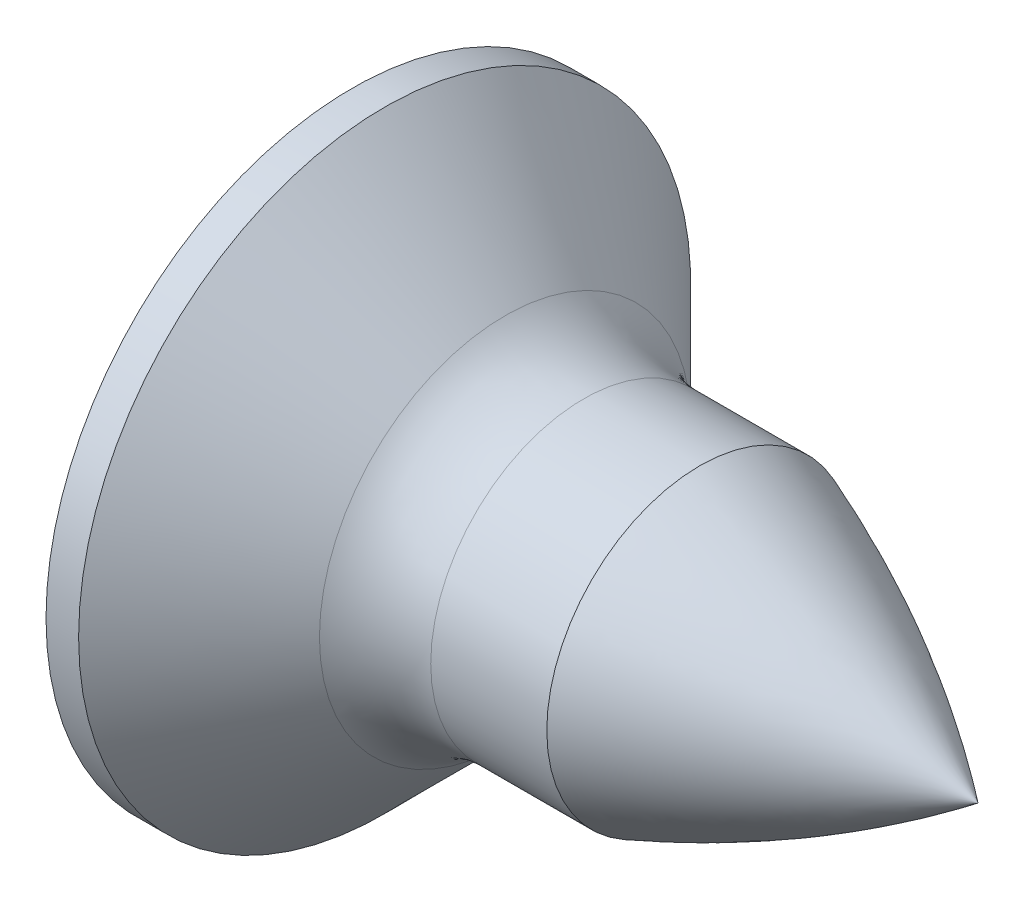
ISO-10303-21;
HEADER;
FILE_DESCRIPTION(('STEP AP214'),'2;1');
FILE_NAME('part.step','',(''),(''),'','','');
FILE_SCHEMA(('AUTOMOTIVE_DESIGN { 1 0 10303 214 1 1 1 1 }'));
ENDSEC;
DATA;
#1=APPLICATION_CONTEXT('core data for automotive mechanical design processes');
#2=APPLICATION_PROTOCOL_DEFINITION('international standard','automotive_design',2000,#1);
#3=PRODUCT_CONTEXT('',#1,'mechanical');
#4=PRODUCT('Part','Part','',(#3));
#5=PRODUCT_RELATED_PRODUCT_CATEGORY('part','',(#4));
#6=PRODUCT_DEFINITION_FORMATION('','',#4);
#7=PRODUCT_DEFINITION_CONTEXT('part definition',#1,'design');
#8=PRODUCT_DEFINITION('design','',#6,#7);
#9=PRODUCT_DEFINITION_SHAPE('','',#8);
#10=(LENGTH_UNIT() NAMED_UNIT(*) SI_UNIT(.MILLI.,.METRE.));
#11=(NAMED_UNIT(*) PLANE_ANGLE_UNIT() SI_UNIT($,.RADIAN.));
#12=(NAMED_UNIT(*) SI_UNIT($,.STERADIAN.) SOLID_ANGLE_UNIT());
#13=UNCERTAINTY_MEASURE_WITH_UNIT(LENGTH_MEASURE(1.E-05),#10,'distance_accuracy_value','');
#14=(GEOMETRIC_REPRESENTATION_CONTEXT(3) GLOBAL_UNCERTAINTY_ASSIGNED_CONTEXT((#13)) GLOBAL_UNIT_ASSIGNED_CONTEXT((#10,
#11,#12)) REPRESENTATION_CONTEXT('',''));
#15=CARTESIAN_POINT('',(0.,0.,0.));
#16=DIRECTION('',(0.,0.,1.));
#17=DIRECTION('',(1.,0.,0.));
#18=AXIS2_PLACEMENT_3D('',#15,#16,#17);
#19=CARTESIAN_POINT('',(-20.4182283145145,0.,0.));
#20=DIRECTION('',(-1.,0.,0.));
#21=DIRECTION('',(0.,0.,1.));
#22=AXIS2_PLACEMENT_3D('',#19,#20,#21);
#23=CYLINDRICAL_SURFACE('',#22,1.09999999999999);
#24=CARTESIAN_POINT('',(2.16568542494922,0.,0.));
#25=DIRECTION('',(-1.,0.,0.));
#26=DIRECTION('',(0.,0.,1.));
#27=AXIS2_PLACEMENT_3D('',#24,#25,#26);
#28=CIRCLE('',#27,1.09999999999999);
#29=CARTESIAN_POINT('',(2.16568542494922,0.,1.09999999999999));
#30=VERTEX_POINT('',#29);
#31=EDGE_CURVE('E189',#30,#30,#28,.T.);
#32=ORIENTED_EDGE('',*,*,#31,.F.);
#33=EDGE_LOOP('',(#32));
#34=FACE_BOUND('',#33,.T.);
#35=CARTESIAN_POINT('',(3.,0.,0.));
#36=DIRECTION('',(1.,0.,0.));
#37=DIRECTION('',(0.,1.,0.));
#38=AXIS2_PLACEMENT_3D('',#35,#36,#37);
#39=CIRCLE('',#38,1.1);
#40=CARTESIAN_POINT('',(3.,1.09999999999999,0.));
#41=VERTEX_POINT('',#40);
#42=EDGE_CURVE('E296',#41,#41,#39,.T.);
#43=ORIENTED_EDGE('',*,*,#42,.F.);
#44=EDGE_LOOP('',(#43));
#45=FACE_BOUND('',#44,.T.);
#46=ADVANCED_FACE('F49',(#34,#45),#23,.T.);
#47=CARTESIAN_POINT('',(5.09,0.,0.));
#48=DIRECTION('',(-1.,0.,0.));
#49=DIRECTION('',(0.,1.,0.));
#50=AXIS2_PLACEMENT_3D('',#47,#48,#49);
#51=SPHERICAL_SURFACE('',#50,5.09);
#52=CARTESIAN_POINT('',(0.5,0.,0.));
#53=DIRECTION('',(-1.,0.,0.));
#54=DIRECTION('',(0.,0.,1.));
#55=AXIS2_PLACEMENT_3D('',#52,#53,#54);
#56=CIRCLE('',#55,2.19999999999999);
#57=CARTESIAN_POINT('',(0.5,0.,2.19999999999999));
#58=VERTEX_POINT('',#57);
#59=EDGE_CURVE('E268',#58,#58,#56,.T.);
#60=ORIENTED_EDGE('',*,*,#59,.T.);
#61=EDGE_LOOP('',(#60));
#62=FACE_BOUND('',#61,.T.);
#63=CARTESIAN_POINT('',(5.09,0.,-0.220000000000001));
#64=DIRECTION('',(0.,0.,1.));
#65=DIRECTION('',(1.,0.,0.));
#66=AXIS2_PLACEMENT_3D('',#63,#64,#65);
#67=CIRCLE('',#66,5.08524335700859);
#68=CARTESIAN_POINT('',(0.111345989317939,1.0357143630941,-0.220000000000001));
#69=VERTEX_POINT('',#68);
#70=CARTESIAN_POINT('',(0.00951773942669838,0.219999999999999,-0.220000000000001));
#71=VERTEX_POINT('',#70);
#72=EDGE_CURVE('E11',#69,#71,#67,.T.);
#73=ORIENTED_EDGE('',*,*,#72,.F.);
#74=CARTESIAN_POINT('',(4.29381397208144,-1.3790346526314,0.));
#75=DIRECTION('',(-0.500000000000001,-0.866025403784438,0.));
#76=DIRECTION('',(0.866025403784438,-0.500000000000001,0.));
#77=AXIS2_PLACEMENT_3D('',#74,#75,#76);
#78=CIRCLE('',#77,4.83450630734815);
#79=CARTESIAN_POINT('',(0.111345989317939,1.0357143630941,0.219999999999999));
#80=VERTEX_POINT('',#79);
#81=EDGE_CURVE('E60',#80,#69,#78,.T.);
#82=ORIENTED_EDGE('',*,*,#81,.F.);
#83=CARTESIAN_POINT('',(5.09,0.,0.219999999999999));
#84=DIRECTION('',(0.,0.,-1.));
#85=DIRECTION('',(0.,1.,0.));
#86=AXIS2_PLACEMENT_3D('',#83,#84,#85);
#87=CIRCLE('',#86,5.08524335700859);
#88=CARTESIAN_POINT('',(0.00951773942669838,0.219999999999999,0.219999999999999));
#89=VERTEX_POINT('',#88);
#90=EDGE_CURVE('E184',#89,#80,#87,.T.);
#91=ORIENTED_EDGE('',*,*,#90,.F.);
#92=CARTESIAN_POINT('',(5.09,0.219999999999999,0.));
#93=DIRECTION('',(0.,-1.,0.));
#94=DIRECTION('',(0.,0.,-1.));
#95=AXIS2_PLACEMENT_3D('',#92,#93,#94);
#96=CIRCLE('',#95,5.08524335700859);
#97=CARTESIAN_POINT('',(0.111345989317938,0.219999999999999,1.0357143630941));
#98=VERTEX_POINT('',#97);
#99=EDGE_CURVE('E177',#98,#89,#96,.T.);
#100=ORIENTED_EDGE('',*,*,#99,.F.);
#101=CARTESIAN_POINT('',(4.29381397208144,0.,-1.3790346526314));
#102=DIRECTION('',(-0.500000000000001,0.,-0.866025403784438));
#103=DIRECTION('',(-0.866025403784438,0.,0.500000000000001));
#104=AXIS2_PLACEMENT_3D('',#101,#102,#103);
#105=CIRCLE('',#104,4.83450630734815);
#106=CARTESIAN_POINT('',(0.111345989317938,-0.220000000000001,1.0357143630941));
#107=VERTEX_POINT('',#106);
#108=EDGE_CURVE('E173',#107,#98,#105,.T.);
#109=ORIENTED_EDGE('',*,*,#108,.F.);
#110=CARTESIAN_POINT('',(5.09,-0.220000000000001,0.));
#111=DIRECTION('',(0.,1.,0.));
#112=DIRECTION('',(0.,0.,1.));
#113=AXIS2_PLACEMENT_3D('',#110,#111,#112);
#114=CIRCLE('',#113,5.08524335700859);
#115=CARTESIAN_POINT('',(0.00951773942669838,-0.220000000000001,0.219999999999999));
#116=VERTEX_POINT('',#115);
#117=EDGE_CURVE('E156',#116,#107,#114,.T.);
#118=ORIENTED_EDGE('',*,*,#117,.F.);
#119=CARTESIAN_POINT('',(5.09,0.,0.219999999999999));
#120=DIRECTION('',(0.,0.,-1.));
#121=DIRECTION('',(-1.,0.,0.));
#122=AXIS2_PLACEMENT_3D('',#119,#120,#121);
#123=CIRCLE('',#122,5.08524335700859);
#124=CARTESIAN_POINT('',(0.111345989317937,-1.0357143630941,0.219999999999999));
#125=VERTEX_POINT('',#124);
#126=EDGE_CURVE('E145',#125,#116,#123,.T.);
#127=ORIENTED_EDGE('',*,*,#126,.F.);
#128=CARTESIAN_POINT('',(4.29381397208144,1.3790346526314,0.));
#129=DIRECTION('',(-0.500000000000001,0.866025403784438,0.));
#130=DIRECTION('',(-0.866025403784438,-0.500000000000001,0.));
#131=AXIS2_PLACEMENT_3D('',#128,#129,#130);
#132=CIRCLE('',#131,4.83450630734815);
#133=CARTESIAN_POINT('',(0.111345989317937,-1.0357143630941,-0.220000000000001));
#134=VERTEX_POINT('',#133);
#135=EDGE_CURVE('E157',#134,#125,#132,.T.);
#136=ORIENTED_EDGE('',*,*,#135,.F.);
#137=CARTESIAN_POINT('',(5.09,0.,-0.220000000000001));
#138=DIRECTION('',(0.,0.,1.));
#139=DIRECTION('',(0.,-1.,0.));
#140=AXIS2_PLACEMENT_3D('',#137,#138,#139);
#141=CIRCLE('',#140,5.08524335700859);
#142=CARTESIAN_POINT('',(0.00951773942669838,-0.220000000000001,-0.220000000000001));
#143=VERTEX_POINT('',#142);
#144=EDGE_CURVE('E193',#143,#134,#141,.T.);
#145=ORIENTED_EDGE('',*,*,#144,.F.);
#146=CARTESIAN_POINT('',(5.09,-0.220000000000001,0.));
#147=DIRECTION('',(0.,1.,0.));
#148=DIRECTION('',(0.,0.,1.));
#149=AXIS2_PLACEMENT_3D('',#146,#147,#148);
#150=CIRCLE('',#149,5.08524335700859);
#151=CARTESIAN_POINT('',(0.111345989317939,-0.220000000000001,-1.0357143630941));
#152=VERTEX_POINT('',#151);
#153=EDGE_CURVE('E190',#152,#143,#150,.T.);
#154=ORIENTED_EDGE('',*,*,#153,.F.);
#155=CARTESIAN_POINT('',(4.29381397208144,0.,1.3790346526314));
#156=DIRECTION('',(-0.500000000000001,0.,0.866025403784438));
#157=DIRECTION('',(0.866025403784438,0.,0.500000000000001));
#158=AXIS2_PLACEMENT_3D('',#155,#156,#157);
#159=CIRCLE('',#158,4.83450630734815);
#160=CARTESIAN_POINT('',(0.111345989317939,0.219999999999999,-1.0357143630941));
#161=VERTEX_POINT('',#160);
#162=EDGE_CURVE('E188',#161,#152,#159,.T.);
#163=ORIENTED_EDGE('',*,*,#162,.F.);
#164=CARTESIAN_POINT('',(5.09,0.219999999999999,0.));
#165=DIRECTION('',(0.,-1.,0.));
#166=DIRECTION('',(0.,0.,-1.));
#167=AXIS2_PLACEMENT_3D('',#164,#165,#166);
#168=CIRCLE('',#167,5.08524335700859);
#169=EDGE_CURVE('E185',#71,#161,#168,.T.);
#170=ORIENTED_EDGE('',*,*,#169,.F.);
#171=EDGE_LOOP('',(#73,#82,#91,#100,#109,#118,#127,#136,#145,#154,#163,#170));
#172=FACE_BOUND('',#171,.T.);
#173=ADVANCED_FACE('F171',(#62,#172),#51,.T.);
#174=CARTESIAN_POINT('',(2.16568542494923,0.,0.));
#175=DIRECTION('',(-1.,0.,0.));
#176=DIRECTION('',(0.,0.,1.));
#177=AXIS2_PLACEMENT_3D('',#174,#175,#176);
#178=TOROIDAL_SURFACE('',#177,1.9,0.800000000000003);
#179=CARTESIAN_POINT('',(1.6,0.,0.));
#180=DIRECTION('',(-1.,0.,0.));
#181=DIRECTION('',(0.,0.,1.));
#182=AXIS2_PLACEMENT_3D('',#179,#180,#181);
#183=CIRCLE('',#182,1.33431457505075);
#184=CARTESIAN_POINT('',(1.6,0.,1.33431457505075));
#185=VERTEX_POINT('',#184);
#186=EDGE_CURVE('E222',#185,#185,#183,.T.);
#187=ORIENTED_EDGE('',*,*,#186,.F.);
#188=EDGE_LOOP('',(#187));
#189=FACE_BOUND('',#188,.T.);
#190=ORIENTED_EDGE('',*,*,#31,.T.);
#191=EDGE_LOOP('',(#190));
#192=FACE_BOUND('',#191,.T.);
#193=ADVANCED_FACE('F334',(#189,#192),#178,.F.);
#194=CARTESIAN_POINT('',(-20.4182283145145,0.,0.));
#195=DIRECTION('',(-1.,0.,0.));
#196=DIRECTION('',(0.,0.,1.));
#197=AXIS2_PLACEMENT_3D('',#194,#195,#196);
#198=CYLINDRICAL_SURFACE('',#197,2.19999999999999);
#199=ORIENTED_EDGE('',*,*,#59,.F.);
#200=EDGE_LOOP('',(#199));
#201=FACE_BOUND('',#200,.T.);
#202=CARTESIAN_POINT('',(0.734314575050726,0.,0.));
#203=DIRECTION('',(-1.,0.,0.));
#204=DIRECTION('',(0.,0.,1.));
#205=AXIS2_PLACEMENT_3D('',#202,#203,#204);
#206=CIRCLE('',#205,2.2);
#207=CARTESIAN_POINT('',(0.734314575050726,0.,2.2));
#208=VERTEX_POINT('',#207);
#209=EDGE_CURVE('E264',#208,#208,#206,.T.);
#210=ORIENTED_EDGE('',*,*,#209,.T.);
#211=EDGE_LOOP('',(#210));
#212=FACE_BOUND('',#211,.T.);
#213=ADVANCED_FACE('F342',(#201,#212),#198,.T.);
#214=CARTESIAN_POINT('',(1.6,0.,0.));
#215=DIRECTION('',(-1.,0.,0.));
#216=DIRECTION('',(0.,0.,1.));
#217=AXIS2_PLACEMENT_3D('',#214,#215,#216);
#218=CONICAL_SURFACE('',#217,1.33431457505075,0.78539816339743);
#219=ORIENTED_EDGE('',*,*,#209,.F.);
#220=EDGE_LOOP('',(#219));
#221=FACE_BOUND('',#220,.T.);
#222=ORIENTED_EDGE('',*,*,#186,.T.);
#223=EDGE_LOOP('',(#222));
#224=FACE_BOUND('',#223,.T.);
#225=ADVANCED_FACE('F472',(#221,#224),#218,.T.);
#226=CARTESIAN_POINT('',(1.2,1.1,-0.220000000000001));
#227=DIRECTION('',(0.,0.,1.));
#228=DIRECTION('',(1.,0.,0.));
#229=AXIS2_PLACEMENT_3D('',#226,#227,#228);
#230=PLANE('',#229);
#231=ORIENTED_EDGE('',*,*,#72,.T.);
#232=DIRECTION('',(-1.,0.,0.));
#233=VECTOR('',#232,1.);
#234=CARTESIAN_POINT('',(1.2,0.219999999999999,-0.220000000000001));
#235=LINE('',#234,#233);
#236=CARTESIAN_POINT('',(1.2,0.219999999999999,-0.220000000000001));
#237=VERTEX_POINT('',#236);
#238=EDGE_CURVE('E69',#237,#71,#235,.T.);
#239=ORIENTED_EDGE('',*,*,#238,.F.);
#240=DIRECTION('',(0.,1.,0.));
#241=VECTOR('',#240,1.);
#242=CARTESIAN_POINT('',(1.2,1.1,-0.220000000000001));
#243=LINE('',#242,#241);
#244=CARTESIAN_POINT('',(1.2,0.407179676972447,-0.220000000000001));
#245=VERTEX_POINT('',#244);
#246=EDGE_CURVE('E219',#237,#245,#243,.T.);
#247=ORIENTED_EDGE('',*,*,#246,.T.);
#248=DIRECTION('',(-0.866025403784438,0.500000000000001,0.));
#249=VECTOR('',#248,1.);
#250=CARTESIAN_POINT('',(0.,1.1,-0.220000000000001));
#251=LINE('',#250,#249);
#252=EDGE_CURVE('E213',#245,#69,#251,.T.);
#253=ORIENTED_EDGE('',*,*,#252,.T.);
#254=EDGE_LOOP('',(#231,#239,#247,#253));
#255=FACE_BOUND('',#254,.T.);
#256=ADVANCED_FACE('F290',(#255),#230,.T.);
#257=CARTESIAN_POINT('',(0.,1.1,0.));
#258=DIRECTION('',(-0.500000000000001,-0.866025403784438,0.));
#259=DIRECTION('',(0.866025403784438,-0.500000000000001,0.));
#260=AXIS2_PLACEMENT_3D('',#257,#258,#259);
#261=PLANE('',#260);
#262=ORIENTED_EDGE('',*,*,#81,.T.);
#263=ORIENTED_EDGE('',*,*,#252,.F.);
#264=DIRECTION('',(0.,0.,1.));
#265=VECTOR('',#264,1.);
#266=CARTESIAN_POINT('',(1.2,0.407179676972447,0.));
#267=LINE('',#266,#265);
#268=CARTESIAN_POINT('',(1.2,0.407179676972447,0.219999999999999));
#269=VERTEX_POINT('',#268);
#270=EDGE_CURVE('E215',#245,#269,#267,.T.);
#271=ORIENTED_EDGE('',*,*,#270,.T.);
#272=DIRECTION('',(-0.866025403784438,0.500000000000001,0.));
#273=VECTOR('',#272,1.);
#274=CARTESIAN_POINT('',(0.899999999999999,0.580384757729336,0.219999999999999));
#275=LINE('',#274,#273);
#276=EDGE_CURVE('E209',#269,#80,#275,.T.);
#277=ORIENTED_EDGE('',*,*,#276,.T.);
#278=EDGE_LOOP('',(#262,#263,#271,#277));
#279=FACE_BOUND('',#278,.T.);
#280=ADVANCED_FACE('F51',(#279),#261,.T.);
#281=CARTESIAN_POINT('',(1.2,1.1,0.219999999999999));
#282=DIRECTION('',(0.,0.,-1.));
#283=DIRECTION('',(0.,1.,0.));
#284=AXIS2_PLACEMENT_3D('',#281,#282,#283);
#285=PLANE('',#284);
#286=ORIENTED_EDGE('',*,*,#90,.T.);
#287=ORIENTED_EDGE('',*,*,#276,.F.);
#288=DIRECTION('',(0.,-1.,0.));
#289=VECTOR('',#288,1.);
#290=CARTESIAN_POINT('',(1.2,1.1,0.219999999999999));
#291=LINE('',#290,#289);
#292=CARTESIAN_POINT('',(1.2,0.219999999999999,0.219999999999999));
#293=VERTEX_POINT('',#292);
#294=EDGE_CURVE('E218',#269,#293,#291,.T.);
#295=ORIENTED_EDGE('',*,*,#294,.T.);
#296=DIRECTION('',(-1.,0.,0.));
#297=VECTOR('',#296,1.);
#298=CARTESIAN_POINT('',(1.2,0.219999999999999,0.219999999999999));
#299=LINE('',#298,#297);
#300=EDGE_CURVE('E214',#293,#89,#299,.T.);
#301=ORIENTED_EDGE('',*,*,#300,.T.);
#302=EDGE_LOOP('',(#286,#287,#295,#301));
#303=FACE_BOUND('',#302,.T.);
#304=ADVANCED_FACE('F280',(#303),#285,.T.);
#305=CARTESIAN_POINT('',(1.2,0.219999999999999,0.219999999999999));
#306=DIRECTION('',(0.,-1.,0.));
#307=DIRECTION('',(0.,0.,-1.));
#308=AXIS2_PLACEMENT_3D('',#305,#306,#307);
#309=PLANE('',#308);
#310=ORIENTED_EDGE('',*,*,#99,.T.);
#311=ORIENTED_EDGE('',*,*,#300,.F.);
#312=DIRECTION('',(0.,0.,1.));
#313=VECTOR('',#312,1.);
#314=CARTESIAN_POINT('',(1.2,0.219999999999999,0.219999999999999));
#315=LINE('',#314,#313);
#316=CARTESIAN_POINT('',(1.2,0.219999999999999,0.407179676972447));
#317=VERTEX_POINT('',#316);
#318=EDGE_CURVE('E230',#293,#317,#315,.T.);
#319=ORIENTED_EDGE('',*,*,#318,.T.);
#320=DIRECTION('',(-0.866025403784438,0.,0.500000000000001));
#321=VECTOR('',#320,1.);
#322=CARTESIAN_POINT('',(0.,0.219999999999999,1.1));
#323=LINE('',#322,#321);
#324=EDGE_CURVE('E226',#317,#98,#323,.T.);
#325=ORIENTED_EDGE('',*,*,#324,.T.);
#326=EDGE_LOOP('',(#310,#311,#319,#325));
#327=FACE_BOUND('',#326,.T.);
#328=ADVANCED_FACE('F348',(#327),#309,.T.);
#329=CARTESIAN_POINT('',(0.,0.,1.1));
#330=DIRECTION('',(-0.500000000000001,0.,-0.866025403784438));
#331=DIRECTION('',(-0.866025403784438,0.,0.500000000000001));
#332=AXIS2_PLACEMENT_3D('',#329,#330,#331);
#333=PLANE('',#332);
#334=ORIENTED_EDGE('',*,*,#108,.T.);
#335=ORIENTED_EDGE('',*,*,#324,.F.);
#336=DIRECTION('',(0.,-1.,0.));
#337=VECTOR('',#336,1.);
#338=CARTESIAN_POINT('',(1.2,0.,0.407179676972447));
#339=LINE('',#338,#337);
#340=CARTESIAN_POINT('',(1.2,-0.220000000000001,0.407179676972447));
#341=VERTEX_POINT('',#340);
#342=EDGE_CURVE('E227',#317,#341,#339,.T.);
#343=ORIENTED_EDGE('',*,*,#342,.T.);
#344=DIRECTION('',(-0.866025403784438,0.,0.500000000000001));
#345=VECTOR('',#344,1.);
#346=CARTESIAN_POINT('',(1.28105117766515,-0.220000000000001,0.360384757729335));
#347=LINE('',#346,#345);
#348=EDGE_CURVE('E167',#341,#107,#347,.T.);
#349=ORIENTED_EDGE('',*,*,#348,.T.);
#350=EDGE_LOOP('',(#334,#335,#343,#349));
#351=FACE_BOUND('',#350,.T.);
#352=ADVANCED_FACE('F346',(#351),#333,.T.);
#353=CARTESIAN_POINT('',(1.2,-0.220000000000001,0.219999999999999));
#354=DIRECTION('',(0.,1.,0.));
#355=DIRECTION('',(0.,0.,1.));
#356=AXIS2_PLACEMENT_3D('',#353,#354,#355);
#357=PLANE('',#356);
#358=ORIENTED_EDGE('',*,*,#117,.T.);
#359=ORIENTED_EDGE('',*,*,#348,.F.);
#360=DIRECTION('',(0.,0.,-1.));
#361=VECTOR('',#360,1.);
#362=CARTESIAN_POINT('',(1.2,-0.220000000000001,0.219999999999999));
#363=LINE('',#362,#361);
#364=CARTESIAN_POINT('',(1.2,-0.220000000000001,0.219999999999999));
#365=VERTEX_POINT('',#364);
#366=EDGE_CURVE('E165',#341,#365,#363,.T.);
#367=ORIENTED_EDGE('',*,*,#366,.T.);
#368=DIRECTION('',(-1.,0.,0.));
#369=VECTOR('',#368,1.);
#370=CARTESIAN_POINT('',(1.2,-0.220000000000001,0.219999999999999));
#371=LINE('',#370,#369);
#372=EDGE_CURVE('E148',#365,#116,#371,.T.);
#373=ORIENTED_EDGE('',*,*,#372,.T.);
#374=EDGE_LOOP('',(#358,#359,#367,#373));
#375=FACE_BOUND('',#374,.T.);
#376=ADVANCED_FACE('F161',(#375),#357,.T.);
#377=CARTESIAN_POINT('',(1.2,-1.1,0.219999999999999));
#378=DIRECTION('',(0.,0.,-1.));
#379=DIRECTION('',(-1.,0.,0.));
#380=AXIS2_PLACEMENT_3D('',#377,#378,#379);
#381=PLANE('',#380);
#382=ORIENTED_EDGE('',*,*,#126,.T.);
#383=ORIENTED_EDGE('',*,*,#372,.F.);
#384=DIRECTION('',(0.,-1.,0.));
#385=VECTOR('',#384,1.);
#386=CARTESIAN_POINT('',(1.2,-1.1,0.219999999999999));
#387=LINE('',#386,#385);
#388=CARTESIAN_POINT('',(1.2,-0.407179676972448,0.219999999999999));
#389=VERTEX_POINT('',#388);
#390=EDGE_CURVE('E204',#365,#389,#387,.T.);
#391=ORIENTED_EDGE('',*,*,#390,.T.);
#392=DIRECTION('',(-0.866025403784438,-0.500000000000001,0.));
#393=VECTOR('',#392,1.);
#394=CARTESIAN_POINT('',(0.,-1.1,0.219999999999999));
#395=LINE('',#394,#393);
#396=EDGE_CURVE('E151',#389,#125,#395,.T.);
#397=ORIENTED_EDGE('',*,*,#396,.T.);
#398=EDGE_LOOP('',(#382,#383,#391,#397));
#399=FACE_BOUND('',#398,.T.);
#400=ADVANCED_FACE('F147',(#399),#381,.T.);
#401=CARTESIAN_POINT('',(0.,-1.1,0.));
#402=DIRECTION('',(-0.500000000000001,0.866025403784438,0.));
#403=DIRECTION('',(-0.866025403784438,-0.500000000000001,0.));
#404=AXIS2_PLACEMENT_3D('',#401,#402,#403);
#405=PLANE('',#404);
#406=ORIENTED_EDGE('',*,*,#135,.T.);
#407=ORIENTED_EDGE('',*,*,#396,.F.);
#408=DIRECTION('',(0.,0.,-1.));
#409=VECTOR('',#408,1.);
#410=CARTESIAN_POINT('',(1.2,-0.407179676972448,0.));
#411=LINE('',#410,#409);
#412=CARTESIAN_POINT('',(1.2,-0.407179676972449,-0.220000000000001));
#413=VERTEX_POINT('',#412);
#414=EDGE_CURVE('E201',#389,#413,#411,.T.);
#415=ORIENTED_EDGE('',*,*,#414,.T.);
#416=DIRECTION('',(-0.866025403784438,-0.500000000000001,0.));
#417=VECTOR('',#416,1.);
#418=CARTESIAN_POINT('',(0.899999999999999,-0.580384757729337,-0.220000000000001));
#419=LINE('',#418,#417);
#420=EDGE_CURVE('E196',#413,#134,#419,.T.);
#421=ORIENTED_EDGE('',*,*,#420,.T.);
#422=EDGE_LOOP('',(#406,#407,#415,#421));
#423=FACE_BOUND('',#422,.T.);
#424=ADVANCED_FACE('F310',(#423),#405,.T.);
#425=CARTESIAN_POINT('',(1.2,-1.1,-0.220000000000001));
#426=DIRECTION('',(0.,0.,1.));
#427=DIRECTION('',(0.,-1.,0.));
#428=AXIS2_PLACEMENT_3D('',#425,#426,#427);
#429=PLANE('',#428);
#430=ORIENTED_EDGE('',*,*,#144,.T.);
#431=ORIENTED_EDGE('',*,*,#420,.F.);
#432=DIRECTION('',(0.,1.,0.));
#433=VECTOR('',#432,1.);
#434=CARTESIAN_POINT('',(1.2,-1.1,-0.220000000000001));
#435=LINE('',#434,#433);
#436=CARTESIAN_POINT('',(1.2,-0.220000000000001,-0.220000000000001));
#437=VERTEX_POINT('',#436);
#438=EDGE_CURVE('E134',#413,#437,#435,.T.);
#439=ORIENTED_EDGE('',*,*,#438,.T.);
#440=DIRECTION('',(-1.,0.,0.));
#441=VECTOR('',#440,1.);
#442=CARTESIAN_POINT('',(1.2,-0.220000000000001,-0.220000000000001));
#443=LINE('',#442,#441);
#444=EDGE_CURVE('E200',#437,#143,#443,.T.);
#445=ORIENTED_EDGE('',*,*,#444,.T.);
#446=EDGE_LOOP('',(#430,#431,#439,#445));
#447=FACE_BOUND('',#446,.T.);
#448=ADVANCED_FACE('F317',(#447),#429,.T.);
#449=CARTESIAN_POINT('',(1.2,-0.220000000000001,-0.220000000000001));
#450=DIRECTION('',(0.,1.,0.));
#451=DIRECTION('',(0.,0.,1.));
#452=AXIS2_PLACEMENT_3D('',#449,#450,#451);
#453=PLANE('',#452);
#454=ORIENTED_EDGE('',*,*,#153,.T.);
#455=ORIENTED_EDGE('',*,*,#444,.F.);
#456=DIRECTION('',(0.,0.,-1.));
#457=VECTOR('',#456,1.);
#458=CARTESIAN_POINT('',(1.2,-0.220000000000001,-0.220000000000001));
#459=LINE('',#458,#457);
#460=CARTESIAN_POINT('',(1.2,-0.220000000000001,-0.407179676972449));
#461=VERTEX_POINT('',#460);
#462=EDGE_CURVE('E126',#437,#461,#459,.T.);
#463=ORIENTED_EDGE('',*,*,#462,.T.);
#464=DIRECTION('',(-0.866025403784438,0.,-0.500000000000001));
#465=VECTOR('',#464,1.);
#466=CARTESIAN_POINT('',(0.,-0.220000000000001,-1.1));
#467=LINE('',#466,#465);
#468=EDGE_CURVE('E53',#461,#152,#467,.T.);
#469=ORIENTED_EDGE('',*,*,#468,.T.);
#470=EDGE_LOOP('',(#454,#455,#463,#469));
#471=FACE_BOUND('',#470,.T.);
#472=ADVANCED_FACE('F316',(#471),#453,.T.);
#473=CARTESIAN_POINT('',(0.,0.,-1.1));
#474=DIRECTION('',(-0.500000000000001,0.,0.866025403784438));
#475=DIRECTION('',(0.866025403784438,0.,0.500000000000001));
#476=AXIS2_PLACEMENT_3D('',#473,#474,#475);
#477=PLANE('',#476);
#478=ORIENTED_EDGE('',*,*,#162,.T.);
#479=ORIENTED_EDGE('',*,*,#468,.F.);
#480=DIRECTION('',(0.,1.,0.));
#481=VECTOR('',#480,1.);
#482=CARTESIAN_POINT('',(1.2,0.,-0.407179676972448));
#483=LINE('',#482,#481);
#484=CARTESIAN_POINT('',(1.2,0.219999999999999,-0.407179676972449));
#485=VERTEX_POINT('',#484);
#486=EDGE_CURVE('E240',#461,#485,#483,.T.);
#487=ORIENTED_EDGE('',*,*,#486,.T.);
#488=DIRECTION('',(-0.866025403784438,0.,-0.500000000000001));
#489=VECTOR('',#488,1.);
#490=CARTESIAN_POINT('',(1.28105117766515,0.219999999999999,-0.360384757729336));
#491=LINE('',#490,#489);
#492=EDGE_CURVE('E237',#485,#161,#491,.T.);
#493=ORIENTED_EDGE('',*,*,#492,.T.);
#494=EDGE_LOOP('',(#478,#479,#487,#493));
#495=FACE_BOUND('',#494,.T.);
#496=ADVANCED_FACE('F313',(#495),#477,.T.);
#497=CARTESIAN_POINT('',(1.2,0.219999999999999,-0.220000000000001));
#498=DIRECTION('',(0.,-1.,0.));
#499=DIRECTION('',(0.,0.,-1.));
#500=AXIS2_PLACEMENT_3D('',#497,#498,#499);
#501=PLANE('',#500);
#502=ORIENTED_EDGE('',*,*,#169,.T.);
#503=ORIENTED_EDGE('',*,*,#492,.F.);
#504=DIRECTION('',(0.,0.,1.));
#505=VECTOR('',#504,1.);
#506=CARTESIAN_POINT('',(1.2,0.219999999999999,-0.220000000000001));
#507=LINE('',#506,#505);
#508=EDGE_CURVE('E242',#485,#237,#507,.T.);
#509=ORIENTED_EDGE('',*,*,#508,.T.);
#510=ORIENTED_EDGE('',*,*,#238,.T.);
#511=EDGE_LOOP('',(#502,#503,#509,#510));
#512=FACE_BOUND('',#511,.T.);
#513=ADVANCED_FACE('F312',(#512),#501,.T.);
#514=CARTESIAN_POINT('',(1.2,-0.220000000000001,-0.220000000000001));
#515=DIRECTION('',(1.,0.,0.));
#516=DIRECTION('',(0.,0.,-1.));
#517=AXIS2_PLACEMENT_3D('',#514,#515,#516);
#518=PLANE('',#517);
#519=ORIENTED_EDGE('',*,*,#246,.F.);
#520=ORIENTED_EDGE('',*,*,#508,.F.);
#521=ORIENTED_EDGE('',*,*,#486,.F.);
#522=ORIENTED_EDGE('',*,*,#462,.F.);
#523=ORIENTED_EDGE('',*,*,#438,.F.);
#524=ORIENTED_EDGE('',*,*,#414,.F.);
#525=ORIENTED_EDGE('',*,*,#390,.F.);
#526=ORIENTED_EDGE('',*,*,#366,.F.);
#527=ORIENTED_EDGE('',*,*,#342,.F.);
#528=ORIENTED_EDGE('',*,*,#318,.F.);
#529=ORIENTED_EDGE('',*,*,#294,.F.);
#530=ORIENTED_EDGE('',*,*,#270,.F.);
#531=EDGE_LOOP('',(#519,#520,#521,#522,#523,#524,#525,#526,#527,#528,#529,#530));
#532=FACE_BOUND('',#531,.T.);
#533=ADVANCED_FACE('F311',(#532),#518,.F.);
#534=CARTESIAN_POINT('',(0.184082861428295,-6.38803116103947,0.));
#535=DIRECTION('',(0.,0.,-1.));
#536=DIRECTION('',(0.,1.,0.));
#537=AXIS2_PLACEMENT_3D('',#534,#535,#536);
#538=CIRCLE('',#537,8.);
#539=TRIMMED_CURVE('',#538,(PARAMETER_VALUE(-0.645990488143612)),
(PARAMETER_VALUE(0.645990488143612)),.T.,.PARAMETER.);
#540=CARTESIAN_POINT('',(0.184082861428294,0.,0.));
#541=DIRECTION('',(1.,0.,0.));
#542=AXIS1_PLACEMENT('',#540,#541);
#543=SURFACE_OF_REVOLUTION('',#539,#542);
#544=ORIENTED_EDGE('',*,*,#42,.T.);
#545=EDGE_LOOP('',(#544));
#546=FACE_BOUND('',#545,.T.);
#547=CARTESIAN_POINT('',(5.,0.,0.));
#548=VERTEX_POINT('',#547);
#549=VERTEX_LOOP('',#548);
#550=FACE_BOUND('',#549,.T.);
#551=ADVANCED_FACE('F364',(#546,#550),#543,.T.);
#552=CLOSED_SHELL('',(#46,#173,#193,#213,#225,#256,#280,#304,#328,#352,#376,#400,#424,#448,#472,
#496,#513,#533,#551));
#553=MANIFOLD_SOLID_BREP('B2',#552);
#554=ADVANCED_BREP_SHAPE_REPRESENTATION('',(#18,#553),#14);
#555=SHAPE_DEFINITION_REPRESENTATION(#9,#554);
ENDSEC;
END-ISO-10303-21;
